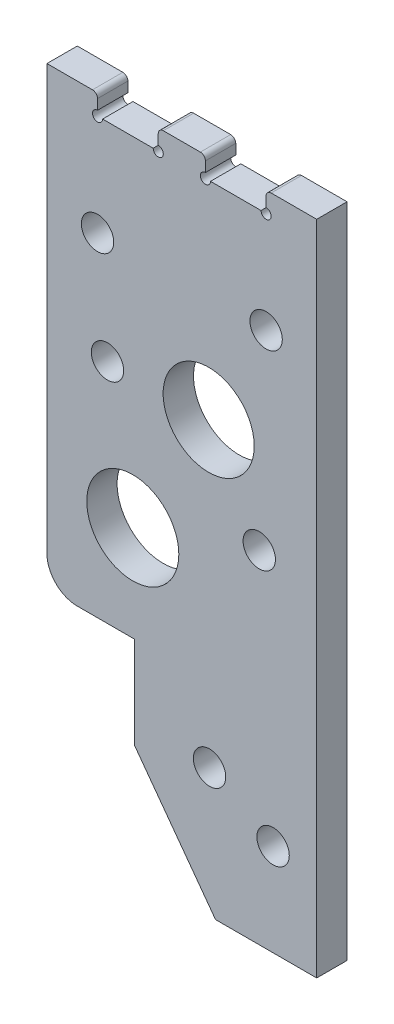
ISO-10303-21;
HEADER;
FILE_DESCRIPTION(('STEP AP214'),'2;1');
FILE_NAME('part.step','',(''),(''),'','','');
FILE_SCHEMA(('AUTOMOTIVE_DESIGN { 1 0 10303 214 1 1 1 1 }'));
ENDSEC;
DATA;
#1=APPLICATION_CONTEXT('core data for automotive mechanical design processes');
#2=APPLICATION_PROTOCOL_DEFINITION('international standard','automotive_design',2000,#1);
#3=PRODUCT_CONTEXT('',#1,'mechanical');
#4=PRODUCT('Part','Part','',(#3));
#5=PRODUCT_RELATED_PRODUCT_CATEGORY('part','',(#4));
#6=PRODUCT_DEFINITION_FORMATION('','',#4);
#7=PRODUCT_DEFINITION_CONTEXT('part definition',#1,'design');
#8=PRODUCT_DEFINITION('design','',#6,#7);
#9=PRODUCT_DEFINITION_SHAPE('','',#8);
#10=(LENGTH_UNIT() NAMED_UNIT(*) SI_UNIT(.MILLI.,.METRE.));
#11=(NAMED_UNIT(*) PLANE_ANGLE_UNIT() SI_UNIT($,.RADIAN.));
#12=(NAMED_UNIT(*) SI_UNIT($,.STERADIAN.) SOLID_ANGLE_UNIT());
#13=UNCERTAINTY_MEASURE_WITH_UNIT(LENGTH_MEASURE(1.E-05),#10,'distance_accuracy_value','');
#14=(GEOMETRIC_REPRESENTATION_CONTEXT(3) GLOBAL_UNCERTAINTY_ASSIGNED_CONTEXT((#13)) GLOBAL_UNIT_ASSIGNED_CONTEXT((#10,
#11,#12)) REPRESENTATION_CONTEXT('',''));
#15=CARTESIAN_POINT('',(0.,0.,0.));
#16=DIRECTION('',(0.,0.,1.));
#17=DIRECTION('',(1.,0.,0.));
#18=AXIS2_PLACEMENT_3D('',#15,#16,#17);
#19=CARTESIAN_POINT('',(0.,58.0360342106986,0.));
#20=DIRECTION('',(0.,-1.,0.));
#21=DIRECTION('',(0.,0.,-1.));
#22=AXIS2_PLACEMENT_3D('',#19,#20,#21);
#23=PLANE('',#22);
#24=DIRECTION('',(1.,0.,0.));
#25=VECTOR('',#24,1.);
#26=CARTESIAN_POINT('',(0.,58.0360342106986,3.));
#27=LINE('',#26,#25);
#28=CARTESIAN_POINT('',(-5.0000000000002,58.0360342106986,3.));
#29=VERTEX_POINT('',#28);
#30=CARTESIAN_POINT('',(-0.500000000000204,58.0360342106986,3.));
#31=VERTEX_POINT('',#30);
#32=EDGE_CURVE('E328',#29,#31,#27,.T.);
#33=ORIENTED_EDGE('',*,*,#32,.T.);
#34=DIRECTION('',(0.,0.,1.));
#35=VECTOR('',#34,1.);
#36=CARTESIAN_POINT('',(-0.500000000000204,58.0360342106986,0.));
#37=LINE('',#36,#35);
#38=CARTESIAN_POINT('',(-0.500000000000204,58.0360342106986,0.));
#39=VERTEX_POINT('',#38);
#40=EDGE_CURVE('E11',#31,#39,#37,.F.);
#41=ORIENTED_EDGE('',*,*,#40,.T.);
#42=DIRECTION('',(1.,0.,0.));
#43=VECTOR('',#42,1.);
#44=CARTESIAN_POINT('',(0.,58.0360342106986,0.));
#45=LINE('',#44,#43);
#46=CARTESIAN_POINT('',(-5.0000000000002,58.0360342106986,0.));
#47=VERTEX_POINT('',#46);
#48=EDGE_CURVE('E322',#47,#39,#45,.T.);
#49=ORIENTED_EDGE('',*,*,#48,.F.);
#50=DIRECTION('',(0.,0.,1.));
#51=VECTOR('',#50,1.);
#52=CARTESIAN_POINT('',(-5.0000000000002,58.0360342106986,0.));
#53=LINE('',#52,#51);
#54=EDGE_CURVE('E333',#47,#29,#53,.T.);
#55=ORIENTED_EDGE('',*,*,#54,.T.);
#56=EDGE_LOOP('',(#33,#41,#49,#55));
#57=FACE_BOUND('',#56,.T.);
#58=ADVANCED_FACE('F44',(#57),#23,.F.);
#59=CARTESIAN_POINT('',(6.4999999999998,58.0360342106986,3.));
#60=VERTEX_POINT('',#59);
#61=CARTESIAN_POINT('',(10.1622818720618,58.0360342106986,3.));
#62=VERTEX_POINT('',#61);
#63=EDGE_CURVE('E331',#60,#62,#27,.T.);
#64=ORIENTED_EDGE('',*,*,#63,.T.);
#65=DIRECTION('',(0.,0.,1.));
#66=VECTOR('',#65,1.);
#67=CARTESIAN_POINT('',(10.1622818720618,58.0360342106986,0.));
#68=LINE('',#67,#66);
#69=CARTESIAN_POINT('',(10.1622818720618,58.0360342106986,0.));
#70=VERTEX_POINT('',#69);
#71=EDGE_CURVE('E515',#62,#70,#68,.F.);
#72=ORIENTED_EDGE('',*,*,#71,.T.);
#73=CARTESIAN_POINT('',(6.4999999999998,58.0360342106986,0.));
#74=VERTEX_POINT('',#73);
#75=EDGE_CURVE('E326',#74,#70,#45,.T.);
#76=ORIENTED_EDGE('',*,*,#75,.F.);
#77=DIRECTION('',(0.,0.,1.));
#78=VECTOR('',#77,1.);
#79=CARTESIAN_POINT('',(6.4999999999998,58.0360342106986,0.));
#80=LINE('',#79,#78);
#81=EDGE_CURVE('E511',#74,#60,#80,.T.);
#82=ORIENTED_EDGE('',*,*,#81,.T.);
#83=EDGE_LOOP('',(#64,#72,#76,#82));
#84=FACE_BOUND('',#83,.T.);
#85=ADVANCED_FACE('F592',(#84),#23,.F.);
#86=CARTESIAN_POINT('',(21.6622818720618,0.,3.));
#87=DIRECTION('',(-1.,0.,0.));
#88=DIRECTION('',(0.,0.,1.));
#89=AXIS2_PLACEMENT_3D('',#86,#87,#88);
#90=PLANE('',#89);
#91=DIRECTION('',(0.,1.,0.));
#92=VECTOR('',#91,1.);
#93=CARTESIAN_POINT('',(21.6622818720618,0.,0.));
#94=LINE('',#93,#92);
#95=CARTESIAN_POINT('',(21.6622818720618,-6.90499539699892,0.));
#96=VERTEX_POINT('',#95);
#97=CARTESIAN_POINT('',(21.6622818720618,58.0360342106986,0.));
#98=VERTEX_POINT('',#97);
#99=EDGE_CURVE('E408',#96,#98,#94,.T.);
#100=ORIENTED_EDGE('',*,*,#99,.T.);
#101=DIRECTION('',(0.,0.,1.));
#102=VECTOR('',#101,1.);
#103=CARTESIAN_POINT('',(21.6622818720618,58.0360342106986,0.));
#104=LINE('',#103,#102);
#105=CARTESIAN_POINT('',(21.6622818720618,58.0360342106986,3.));
#106=VERTEX_POINT('',#105);
#107=EDGE_CURVE('E325',#98,#106,#104,.T.);
#108=ORIENTED_EDGE('',*,*,#107,.T.);
#109=DIRECTION('',(0.,1.,0.));
#110=VECTOR('',#109,1.);
#111=CARTESIAN_POINT('',(21.6622818720618,0.,3.));
#112=LINE('',#111,#110);
#113=CARTESIAN_POINT('',(21.6622818720618,-6.90499539699892,3.));
#114=VERTEX_POINT('',#113);
#115=EDGE_CURVE('E387',#114,#106,#112,.T.);
#116=ORIENTED_EDGE('',*,*,#115,.F.);
#117=DIRECTION('',(0.,0.,-1.));
#118=VECTOR('',#117,1.);
#119=CARTESIAN_POINT('',(21.6622818720618,-6.90499539699892,3.));
#120=LINE('',#119,#118);
#121=EDGE_CURVE('E400',#114,#96,#120,.T.);
#122=ORIENTED_EDGE('',*,*,#121,.T.);
#123=EDGE_LOOP('',(#100,#108,#116,#122));
#124=FACE_BOUND('',#123,.T.);
#125=ADVANCED_FACE('F598',(#124),#90,.F.);
#126=CARTESIAN_POINT('',(3.66228187206179,0.,3.));
#127=DIRECTION('',(1.,0.,0.));
#128=DIRECTION('',(0.,0.,-1.));
#129=AXIS2_PLACEMENT_3D('',#126,#127,#128);
#130=PLANE('',#129);
#131=DIRECTION('',(0.,-1.,0.));
#132=VECTOR('',#131,1.);
#133=CARTESIAN_POINT('',(3.66228187206179,0.,0.));
#134=LINE('',#133,#132);
#135=CARTESIAN_POINT('',(3.66228187206179,13.0950046030011,0.));
#136=VERTEX_POINT('',#135);
#137=CARTESIAN_POINT('',(3.66228187206179,3.99641148390984,0.));
#138=VERTEX_POINT('',#137);
#139=EDGE_CURVE('E412',#136,#138,#134,.T.);
#140=ORIENTED_EDGE('',*,*,#139,.T.);
#141=DIRECTION('',(0.,0.,-1.));
#142=VECTOR('',#141,1.);
#143=CARTESIAN_POINT('',(3.66228187206179,3.99641148390984,3.));
#144=LINE('',#143,#142);
#145=CARTESIAN_POINT('',(3.66228187206179,3.99641148390984,3.));
#146=VERTEX_POINT('',#145);
#147=EDGE_CURVE('E427',#146,#138,#144,.T.);
#148=ORIENTED_EDGE('',*,*,#147,.F.);
#149=DIRECTION('',(0.,-1.,0.));
#150=VECTOR('',#149,1.);
#151=CARTESIAN_POINT('',(3.66228187206179,0.,3.));
#152=LINE('',#151,#150);
#153=CARTESIAN_POINT('',(3.66228187206179,13.0950046030011,3.));
#154=VERTEX_POINT('',#153);
#155=EDGE_CURVE('E391',#154,#146,#152,.T.);
#156=ORIENTED_EDGE('',*,*,#155,.F.);
#157=DIRECTION('',(0.,0.,-1.));
#158=VECTOR('',#157,1.);
#159=CARTESIAN_POINT('',(3.66228187206179,13.0950046030011,3.));
#160=LINE('',#159,#158);
#161=EDGE_CURVE('E431',#154,#136,#160,.T.);
#162=ORIENTED_EDGE('',*,*,#161,.T.);
#163=EDGE_LOOP('',(#140,#148,#156,#162));
#164=FACE_BOUND('',#163,.T.);
#165=ADVANCED_FACE('F664',(#164),#130,.F.);
#166=CARTESIAN_POINT('',(4.28657415969723,3.14570345389393,3.));
#167=DIRECTION('',(0.806206221061157,0.591634624681727,0.));
#168=DIRECTION('',(-0.591634624681728,0.806206221061157,0.));
#169=AXIS2_PLACEMENT_3D('',#166,#167,#168);
#170=PLANE('',#169);
#171=DIRECTION('',(0.591634624681727,-0.806206221061157,0.));
#172=VECTOR('',#171,1.);
#173=CARTESIAN_POINT('',(4.28657415969723,3.14570345389393,0.));
#174=LINE('',#173,#172);
#175=CARTESIAN_POINT('',(11.6622818720618,-6.90499539699892,0.));
#176=VERTEX_POINT('',#175);
#177=EDGE_CURVE('E415',#138,#176,#174,.T.);
#178=ORIENTED_EDGE('',*,*,#177,.T.);
#179=DIRECTION('',(0.,0.,-1.));
#180=VECTOR('',#179,1.);
#181=CARTESIAN_POINT('',(11.6622818720618,-6.90499539699892,3.));
#182=LINE('',#181,#180);
#183=CARTESIAN_POINT('',(11.6622818720618,-6.90499539699892,3.));
#184=VERTEX_POINT('',#183);
#185=EDGE_CURVE('E423',#184,#176,#182,.T.);
#186=ORIENTED_EDGE('',*,*,#185,.F.);
#187=DIRECTION('',(0.591634624681727,-0.806206221061157,0.));
#188=VECTOR('',#187,1.);
#189=CARTESIAN_POINT('',(4.28657415969723,3.14570345389393,3.));
#190=LINE('',#189,#188);
#191=EDGE_CURVE('E394',#146,#184,#190,.T.);
#192=ORIENTED_EDGE('',*,*,#191,.F.);
#193=ORIENTED_EDGE('',*,*,#147,.T.);
#194=EDGE_LOOP('',(#178,#186,#192,#193));
#195=FACE_BOUND('',#194,.T.);
#196=ADVANCED_FACE('F660',(#195),#170,.F.);
#197=CARTESIAN_POINT('',(11.0719234852407,5.8086443959848,3.));
#198=DIRECTION('',(0.,0.,-1.));
#199=DIRECTION('',(-1.,0.,0.));
#200=AXIS2_PLACEMENT_3D('',#197,#198,#199);
#201=CYLINDRICAL_SURFACE('',#200,1.6);
#202=CARTESIAN_POINT('',(11.0719234852407,5.8086443959848,3.));
#203=DIRECTION('',(0.,0.,1.));
#204=DIRECTION('',(1.,0.,0.));
#205=AXIS2_PLACEMENT_3D('',#202,#203,#204);
#206=CIRCLE('',#205,1.6);
#207=CARTESIAN_POINT('',(12.6719234852407,5.8086443959848,3.));
#208=VERTEX_POINT('',#207);
#209=EDGE_CURVE('E382',#208,#208,#206,.T.);
#210=ORIENTED_EDGE('',*,*,#209,.T.);
#211=EDGE_LOOP('',(#210));
#212=FACE_BOUND('',#211,.T.);
#213=CARTESIAN_POINT('',(11.0719234852407,5.8086443959848,0.));
#214=DIRECTION('',(0.,0.,1.));
#215=DIRECTION('',(1.,0.,0.));
#216=AXIS2_PLACEMENT_3D('',#213,#214,#215);
#217=CIRCLE('',#216,1.6);
#218=CARTESIAN_POINT('',(12.6719234852407,5.8086443959848,0.));
#219=VERTEX_POINT('',#218);
#220=EDGE_CURVE('E404',#219,#219,#217,.T.);
#221=ORIENTED_EDGE('',*,*,#220,.F.);
#222=EDGE_LOOP('',(#221));
#223=FACE_BOUND('',#222,.T.);
#224=ADVANCED_FACE('F697',(#212,#223),#201,.F.);
#225=CARTESIAN_POINT('',(17.3507061173,2.224156972777,3.));
#226=DIRECTION('',(0.,0.,-1.));
#227=DIRECTION('',(-1.,0.,0.));
#228=AXIS2_PLACEMENT_3D('',#225,#226,#227);
#229=CYLINDRICAL_SURFACE('',#228,1.6);
#230=CARTESIAN_POINT('',(17.3507061173,2.224156972777,3.));
#231=DIRECTION('',(0.,0.,1.));
#232=DIRECTION('',(1.,0.,0.));
#233=AXIS2_PLACEMENT_3D('',#230,#231,#232);
#234=CIRCLE('',#233,1.6);
#235=CARTESIAN_POINT('',(18.9507061173,2.224156972777,3.));
#236=VERTEX_POINT('',#235);
#237=EDGE_CURVE('E378',#236,#236,#234,.T.);
#238=ORIENTED_EDGE('',*,*,#237,.T.);
#239=EDGE_LOOP('',(#238));
#240=FACE_BOUND('',#239,.T.);
#241=CARTESIAN_POINT('',(17.3507061173,2.224156972777,0.));
#242=DIRECTION('',(0.,0.,1.));
#243=DIRECTION('',(1.,0.,0.));
#244=AXIS2_PLACEMENT_3D('',#241,#242,#243);
#245=CIRCLE('',#244,1.6);
#246=CARTESIAN_POINT('',(18.9507061173,2.224156972777,0.));
#247=VERTEX_POINT('',#246);
#248=EDGE_CURVE('E372',#247,#247,#245,.T.);
#249=ORIENTED_EDGE('',*,*,#248,.F.);
#250=EDGE_LOOP('',(#249));
#251=FACE_BOUND('',#250,.T.);
#252=ADVANCED_FACE('F694',(#240,#251),#229,.F.);
#253=CARTESIAN_POINT('',(0.,-6.90499539699891,3.));
#254=DIRECTION('',(0.,1.,0.));
#255=DIRECTION('',(-1.,0.,0.));
#256=AXIS2_PLACEMENT_3D('',#253,#254,#255);
#257=PLANE('',#256);
#258=DIRECTION('',(1.,0.,0.));
#259=VECTOR('',#258,1.);
#260=CARTESIAN_POINT('',(0.,-6.90499539699891,0.));
#261=LINE('',#260,#259);
#262=EDGE_CURVE('E383',#176,#96,#261,.T.);
#263=ORIENTED_EDGE('',*,*,#262,.T.);
#264=ORIENTED_EDGE('',*,*,#121,.F.);
#265=DIRECTION('',(1.,0.,0.));
#266=VECTOR('',#265,1.);
#267=CARTESIAN_POINT('',(0.,-6.90499539699891,3.));
#268=LINE('',#267,#266);
#269=EDGE_CURVE('E397',#184,#114,#268,.T.);
#270=ORIENTED_EDGE('',*,*,#269,.F.);
#271=ORIENTED_EDGE('',*,*,#185,.T.);
#272=EDGE_LOOP('',(#263,#264,#270,#271));
#273=FACE_BOUND('',#272,.T.);
#274=ADVANCED_FACE('F656',(#273),#257,.F.);
#275=CARTESIAN_POINT('',(0.,0.,3.));
#276=DIRECTION('',(0.,0.,1.));
#277=DIRECTION('',(1.,0.,0.));
#278=AXIS2_PLACEMENT_3D('',#275,#276,#277);
#279=PLANE('',#278);
#280=CARTESIAN_POINT('',(16.6622818720618,46.0360342106986,3.));
#281=DIRECTION('',(0.,0.,1.));
#282=DIRECTION('',(-1.,0.,0.));
#283=AXIS2_PLACEMENT_3D('',#280,#281,#282);
#284=CIRCLE('',#283,1.6);
#285=CARTESIAN_POINT('',(15.0622818720618,46.0360342106986,3.));
#286=VERTEX_POINT('',#285);
#287=EDGE_CURVE('E571',#286,#286,#284,.T.);
#288=ORIENTED_EDGE('',*,*,#287,.F.);
#289=EDGE_LOOP('',(#288));
#290=FACE_BOUND('',#289,.T.);
#291=CARTESIAN_POINT('',(17.1622818720618,58.0360342106986,3.));
#292=VERTEX_POINT('',#291);
#293=EDGE_CURVE('E332',#292,#106,#27,.T.);
#294=ORIENTED_EDGE('',*,*,#293,.F.);
#295=CARTESIAN_POINT('',(17.1622818720618,57.5360342106986,3.));
#296=DIRECTION('',(0.,0.,1.));
#297=DIRECTION('',(1.,0.,0.));
#298=AXIS2_PLACEMENT_3D('',#295,#296,#297);
#299=CIRCLE('',#298,0.5);
#300=CARTESIAN_POINT('',(16.6622818720618,57.5360342106986,3.));
#301=VERTEX_POINT('',#300);
#302=EDGE_CURVE('E490',#292,#301,#299,.T.);
#303=ORIENTED_EDGE('',*,*,#302,.T.);
#304=DIRECTION('',(0.,1.,0.));
#305=VECTOR('',#304,1.);
#306=CARTESIAN_POINT('',(16.6622818720618,58.0360342106986,3.));
#307=LINE('',#306,#305);
#308=CARTESIAN_POINT('',(16.6622818720618,56.5360342106986,3.));
#309=VERTEX_POINT('',#308);
#310=EDGE_CURVE('E303',#309,#301,#307,.T.);
#311=ORIENTED_EDGE('',*,*,#310,.F.);
#312=CARTESIAN_POINT('',(16.6622818720618,56.0360342106986,3.));
#313=DIRECTION('',(0.,0.,1.));
#314=DIRECTION('',(1.,0.,0.));
#315=AXIS2_PLACEMENT_3D('',#312,#313,#314);
#316=CIRCLE('',#315,0.499999999999999);
#317=CARTESIAN_POINT('',(16.1622818720618,56.0360342106986,3.));
#318=VERTEX_POINT('',#317);
#319=EDGE_CURVE('E565',#318,#309,#316,.T.);
#320=ORIENTED_EDGE('',*,*,#319,.F.);
#321=DIRECTION('',(1.,0.,0.));
#322=VECTOR('',#321,1.);
#323=CARTESIAN_POINT('',(10.6622818720618,56.0360342106986,3.));
#324=LINE('',#323,#322);
#325=CARTESIAN_POINT('',(11.1622818720618,56.0360342106986,3.));
#326=VERTEX_POINT('',#325);
#327=EDGE_CURVE('E314',#326,#318,#324,.T.);
#328=ORIENTED_EDGE('',*,*,#327,.F.);
#329=CARTESIAN_POINT('',(10.6622818720618,56.0360342106986,3.));
#330=DIRECTION('',(0.,0.,1.));
#331=DIRECTION('',(1.,0.,0.));
#332=AXIS2_PLACEMENT_3D('',#329,#330,#331);
#333=CIRCLE('',#332,0.500000000000001);
#334=CARTESIAN_POINT('',(10.6622818720618,56.5360342106986,3.));
#335=VERTEX_POINT('',#334);
#336=EDGE_CURVE('E268',#335,#326,#333,.T.);
#337=ORIENTED_EDGE('',*,*,#336,.F.);
#338=DIRECTION('',(0.,-1.,0.));
#339=VECTOR('',#338,1.);
#340=CARTESIAN_POINT('',(10.6622818720618,58.0360342106986,3.));
#341=LINE('',#340,#339);
#342=CARTESIAN_POINT('',(10.6622818720618,57.5360342106986,3.));
#343=VERTEX_POINT('',#342);
#344=EDGE_CURVE('E311',#343,#335,#341,.T.);
#345=ORIENTED_EDGE('',*,*,#344,.F.);
#346=CARTESIAN_POINT('',(10.1622818720618,57.5360342106986,3.));
#347=DIRECTION('',(0.,0.,1.));
#348=DIRECTION('',(1.,0.,0.));
#349=AXIS2_PLACEMENT_3D('',#346,#347,#348);
#350=CIRCLE('',#349,0.5);
#351=EDGE_CURVE('E487',#343,#62,#350,.T.);
#352=ORIENTED_EDGE('',*,*,#351,.T.);
#353=ORIENTED_EDGE('',*,*,#63,.F.);
#354=CARTESIAN_POINT('',(6.4999999999998,57.5360342106986,3.));
#355=DIRECTION('',(0.,0.,1.));
#356=DIRECTION('',(1.,0.,0.));
#357=AXIS2_PLACEMENT_3D('',#354,#355,#356);
#358=CIRCLE('',#357,0.5);
#359=CARTESIAN_POINT('',(5.9999999999998,57.5360342106986,3.));
#360=VERTEX_POINT('',#359);
#361=EDGE_CURVE('E286',#60,#360,#358,.T.);
#362=ORIENTED_EDGE('',*,*,#361,.T.);
#363=DIRECTION('',(0.,1.,0.));
#364=VECTOR('',#363,1.);
#365=CARTESIAN_POINT('',(5.9999999999998,58.0360342106986,3.));
#366=LINE('',#365,#364);
#367=CARTESIAN_POINT('',(5.9999999999998,56.5360342106986,3.));
#368=VERTEX_POINT('',#367);
#369=EDGE_CURVE('E274',#368,#360,#366,.T.);
#370=ORIENTED_EDGE('',*,*,#369,.F.);
#371=CARTESIAN_POINT('',(5.9999999999998,56.0360342106986,3.));
#372=DIRECTION('',(0.,0.,1.));
#373=DIRECTION('',(1.,0.,0.));
#374=AXIS2_PLACEMENT_3D('',#371,#372,#373);
#375=CIRCLE('',#374,0.500000000000002);
#376=CARTESIAN_POINT('',(5.49999999999979,56.0360342106986,3.));
#377=VERTEX_POINT('',#376);
#378=EDGE_CURVE('E255',#377,#368,#375,.T.);
#379=ORIENTED_EDGE('',*,*,#378,.F.);
#380=DIRECTION('',(1.,0.,0.));
#381=VECTOR('',#380,1.);
#382=CARTESIAN_POINT('',(-2.03585079067445E-13,56.0360342106986,3.));
#383=LINE('',#382,#381);
#384=CARTESIAN_POINT('',(0.499999999999797,56.0360342106986,3.));
#385=VERTEX_POINT('',#384);
#386=EDGE_CURVE('E289',#385,#377,#383,.T.);
#387=ORIENTED_EDGE('',*,*,#386,.F.);
#388=CARTESIAN_POINT('',(-2.03585079067445E-13,56.0360342106986,3.));
#389=DIRECTION('',(0.,0.,1.));
#390=DIRECTION('',(1.,0.,0.));
#391=AXIS2_PLACEMENT_3D('',#388,#389,#390);
#392=CIRCLE('',#391,0.5);
#393=CARTESIAN_POINT('',(-2.03646311407403E-13,56.5360342106986,3.));
#394=VERTEX_POINT('',#393);
#395=EDGE_CURVE('E267',#394,#385,#392,.T.);
#396=ORIENTED_EDGE('',*,*,#395,.F.);
#397=DIRECTION('',(0.,-1.,0.));
#398=VECTOR('',#397,1.);
#399=CARTESIAN_POINT('',(-2.03830008427275E-13,58.0360342106986,3.));
#400=LINE('',#399,#398);
#401=CARTESIAN_POINT('',(-2.03768776087317E-13,57.5360342106986,3.));
#402=VERTEX_POINT('',#401);
#403=EDGE_CURVE('E295',#402,#394,#400,.T.);
#404=ORIENTED_EDGE('',*,*,#403,.F.);
#405=CARTESIAN_POINT('',(-0.500000000000204,57.5360342106986,3.));
#406=DIRECTION('',(0.,0.,1.));
#407=DIRECTION('',(1.,0.,0.));
#408=AXIS2_PLACEMENT_3D('',#405,#406,#407);
#409=CIRCLE('',#408,0.5);
#410=EDGE_CURVE('E482',#402,#31,#409,.T.);
#411=ORIENTED_EDGE('',*,*,#410,.T.);
#412=ORIENTED_EDGE('',*,*,#32,.F.);
#413=DIRECTION('',(0.,-1.,0.));
#414=VECTOR('',#413,1.);
#415=CARTESIAN_POINT('',(-5.00000000000018,55.0950046030011,3.));
#416=LINE('',#415,#414);
#417=CARTESIAN_POINT('',(-5.00000000000018,16.0950046030011,3.));
#418=VERTEX_POINT('',#417);
#419=EDGE_CURVE('E369',#29,#418,#416,.T.);
#420=ORIENTED_EDGE('',*,*,#419,.T.);
#421=CARTESIAN_POINT('',(-2.00000000000018,16.0950046030011,3.));
#422=DIRECTION('',(0.,0.,1.));
#423=DIRECTION('',(1.,0.,0.));
#424=AXIS2_PLACEMENT_3D('',#421,#422,#423);
#425=CIRCLE('',#424,3.);
#426=CARTESIAN_POINT('',(-2.00000000000018,13.0950046030011,3.));
#427=VERTEX_POINT('',#426);
#428=EDGE_CURVE('E439',#418,#427,#425,.T.);
#429=ORIENTED_EDGE('',*,*,#428,.T.);
#430=DIRECTION('',(1.,0.,0.));
#431=VECTOR('',#430,1.);
#432=CARTESIAN_POINT('',(-5.00000000000018,13.0950046030011,3.));
#433=LINE('',#432,#431);
#434=EDGE_CURVE('E373',#427,#154,#433,.T.);
#435=ORIENTED_EDGE('',*,*,#434,.T.);
#436=ORIENTED_EDGE('',*,*,#155,.T.);
#437=ORIENTED_EDGE('',*,*,#191,.T.);
#438=ORIENTED_EDGE('',*,*,#269,.T.);
#439=ORIENTED_EDGE('',*,*,#115,.T.);
#440=EDGE_LOOP('',(#294,#303,#311,#320,#328,#337,#345,#352,#353,#362,#370,#379,#387,#396,#404,
#411,#412,#420,#429,#435,#436,#437,#438,#439));
#441=FACE_BOUND('',#440,.T.);
#442=CARTESIAN_POINT('',(-2.03830008427275E-13,46.0360342106986,3.));
#443=DIRECTION('',(0.,0.,1.));
#444=DIRECTION('',(1.,0.,0.));
#445=AXIS2_PLACEMENT_3D('',#442,#443,#444);
#446=CIRCLE('',#445,1.6);
#447=CARTESIAN_POINT('',(1.5999999999998,46.0360342106986,3.));
#448=VERTEX_POINT('',#447);
#449=EDGE_CURVE('E337',#448,#448,#446,.F.);
#450=ORIENTED_EDGE('',*,*,#449,.T.);
#451=EDGE_LOOP('',(#450));
#452=FACE_BOUND('',#451,.T.);
#453=CARTESIAN_POINT('',(0.984643758680834,35.5323305802641,3.));
#454=DIRECTION('',(0.,0.,1.));
#455=DIRECTION('',(1.,0.,0.));
#456=AXIS2_PLACEMENT_3D('',#453,#454,#455);
#457=CIRCLE('',#456,1.6);
#458=CARTESIAN_POINT('',(2.58464375868083,35.5323305802641,3.));
#459=VERTEX_POINT('',#458);
#460=EDGE_CURVE('E345',#459,#459,#457,.T.);
#461=ORIENTED_EDGE('',*,*,#460,.F.);
#462=EDGE_LOOP('',(#461));
#463=FACE_BOUND('',#462,.T.);
#464=CARTESIAN_POINT('',(15.9846437586806,26.8720765424193,3.));
#465=DIRECTION('',(0.,0.,1.));
#466=DIRECTION('',(1.,0.,0.));
#467=AXIS2_PLACEMENT_3D('',#464,#465,#466);
#468=CIRCLE('',#467,1.6);
#469=CARTESIAN_POINT('',(17.5846437586806,26.8720765424193,3.));
#470=VERTEX_POINT('',#469);
#471=EDGE_CURVE('E350',#470,#470,#468,.T.);
#472=ORIENTED_EDGE('',*,*,#471,.F.);
#473=EDGE_LOOP('',(#472));
#474=FACE_BOUND('',#473,.T.);
#475=CARTESIAN_POINT('',(10.9846437586808,35.5323305802638,3.));
#476=DIRECTION('',(0.,0.,1.));
#477=DIRECTION('',(1.,0.,0.));
#478=AXIS2_PLACEMENT_3D('',#475,#476,#477);
#479=CIRCLE('',#478,4.5);
#480=CARTESIAN_POINT('',(15.4846437586808,35.5323305802638,3.));
#481=VERTEX_POINT('',#480);
#482=EDGE_CURVE('E354',#481,#481,#479,.T.);
#483=ORIENTED_EDGE('',*,*,#482,.F.);
#484=EDGE_LOOP('',(#483));
#485=FACE_BOUND('',#484,.T.);
#486=CARTESIAN_POINT('',(3.48464375868086,22.5419495234972,3.));
#487=DIRECTION('',(0.,0.,1.));
#488=DIRECTION('',(1.,0.,0.));
#489=AXIS2_PLACEMENT_3D('',#486,#487,#488);
#490=CIRCLE('',#489,4.55);
#491=CARTESIAN_POINT('',(8.03464375868087,22.5419495234972,3.));
#492=VERTEX_POINT('',#491);
#493=EDGE_CURVE('E360',#492,#492,#490,.T.);
#494=ORIENTED_EDGE('',*,*,#493,.F.);
#495=EDGE_LOOP('',(#494));
#496=FACE_BOUND('',#495,.T.);
#497=ORIENTED_EDGE('',*,*,#237,.F.);
#498=EDGE_LOOP('',(#497));
#499=FACE_BOUND('',#498,.T.);
#500=ORIENTED_EDGE('',*,*,#209,.F.);
#501=EDGE_LOOP('',(#500));
#502=FACE_BOUND('',#501,.T.);
#503=ADVANCED_FACE('F283',(#290,#441,#452,#463,#474,#485,#496,#499,#502),#279,.T.);
#504=CARTESIAN_POINT('',(0.,0.,0.));
#505=DIRECTION('',(0.,0.,1.));
#506=DIRECTION('',(1.,0.,0.));
#507=AXIS2_PLACEMENT_3D('',#504,#505,#506);
#508=PLANE('',#507);
#509=CARTESIAN_POINT('',(16.6622818720618,46.0360342106986,0.));
#510=DIRECTION('',(0.,0.,1.));
#511=DIRECTION('',(1.,0.,0.));
#512=AXIS2_PLACEMENT_3D('',#509,#510,#511);
#513=CIRCLE('',#512,1.6);
#514=CARTESIAN_POINT('',(18.2622818720618,46.0360342106986,0.));
#515=VERTEX_POINT('',#514);
#516=EDGE_CURVE('E48',#515,#515,#513,.T.);
#517=ORIENTED_EDGE('',*,*,#516,.T.);
#518=EDGE_LOOP('',(#517));
#519=FACE_BOUND('',#518,.T.);
#520=DIRECTION('',(0.,1.,0.));
#521=VECTOR('',#520,1.);
#522=CARTESIAN_POINT('',(16.6622818720618,58.0360342106986,0.));
#523=LINE('',#522,#521);
#524=CARTESIAN_POINT('',(16.6622818720618,56.5360342106986,0.));
#525=VERTEX_POINT('',#524);
#526=CARTESIAN_POINT('',(16.6622818720618,57.5360342106986,0.));
#527=VERTEX_POINT('',#526);
#528=EDGE_CURVE('E307',#525,#527,#523,.T.);
#529=ORIENTED_EDGE('',*,*,#528,.T.);
#530=CARTESIAN_POINT('',(17.1622818720618,57.5360342106986,0.));
#531=DIRECTION('',(0.,0.,1.));
#532=DIRECTION('',(1.,0.,0.));
#533=AXIS2_PLACEMENT_3D('',#530,#531,#532);
#534=CIRCLE('',#533,0.5);
#535=CARTESIAN_POINT('',(17.1622818720618,58.0360342106986,0.));
#536=VERTEX_POINT('',#535);
#537=EDGE_CURVE('E504',#527,#536,#534,.F.);
#538=ORIENTED_EDGE('',*,*,#537,.T.);
#539=EDGE_CURVE('E327',#536,#98,#45,.T.);
#540=ORIENTED_EDGE('',*,*,#539,.T.);
#541=ORIENTED_EDGE('',*,*,#99,.F.);
#542=ORIENTED_EDGE('',*,*,#262,.F.);
#543=ORIENTED_EDGE('',*,*,#177,.F.);
#544=ORIENTED_EDGE('',*,*,#139,.F.);
#545=DIRECTION('',(1.,0.,0.));
#546=VECTOR('',#545,1.);
#547=CARTESIAN_POINT('',(-5.00000000000018,13.0950046030011,0.));
#548=LINE('',#547,#546);
#549=CARTESIAN_POINT('',(-2.00000000000018,13.0950046030011,0.));
#550=VERTEX_POINT('',#549);
#551=EDGE_CURVE('E365',#550,#136,#548,.T.);
#552=ORIENTED_EDGE('',*,*,#551,.F.);
#553=CARTESIAN_POINT('',(-2.00000000000018,16.0950046030011,0.));
#554=DIRECTION('',(0.,0.,1.));
#555=DIRECTION('',(1.,0.,0.));
#556=AXIS2_PLACEMENT_3D('',#553,#554,#555);
#557=CIRCLE('',#556,3.);
#558=CARTESIAN_POINT('',(-5.00000000000018,16.0950046030011,0.));
#559=VERTEX_POINT('',#558);
#560=EDGE_CURVE('E445',#550,#559,#557,.F.);
#561=ORIENTED_EDGE('',*,*,#560,.T.);
#562=DIRECTION('',(0.,-1.,0.));
#563=VECTOR('',#562,1.);
#564=CARTESIAN_POINT('',(-5.00000000000018,55.0950046030011,0.));
#565=LINE('',#564,#563);
#566=EDGE_CURVE('E368',#47,#559,#565,.T.);
#567=ORIENTED_EDGE('',*,*,#566,.F.);
#568=ORIENTED_EDGE('',*,*,#48,.T.);
#569=CARTESIAN_POINT('',(-0.500000000000204,57.5360342106986,0.));
#570=DIRECTION('',(0.,0.,1.));
#571=DIRECTION('',(1.,0.,0.));
#572=AXIS2_PLACEMENT_3D('',#569,#570,#571);
#573=CIRCLE('',#572,0.5);
#574=CARTESIAN_POINT('',(-2.03768776087317E-13,57.5360342106986,0.));
#575=VERTEX_POINT('',#574);
#576=EDGE_CURVE('E496',#39,#575,#573,.F.);
#577=ORIENTED_EDGE('',*,*,#576,.T.);
#578=DIRECTION('',(0.,-1.,0.));
#579=VECTOR('',#578,1.);
#580=CARTESIAN_POINT('',(-2.03830008427275E-13,58.0360342106986,0.));
#581=LINE('',#580,#579);
#582=CARTESIAN_POINT('',(-2.03646311407403E-13,56.5360342106986,0.));
#583=VERTEX_POINT('',#582);
#584=EDGE_CURVE('E288',#575,#583,#581,.T.);
#585=ORIENTED_EDGE('',*,*,#584,.T.);
#586=CARTESIAN_POINT('',(-2.03585079067445E-13,56.0360342106986,0.));
#587=DIRECTION('',(0.,0.,1.));
#588=DIRECTION('',(1.,0.,0.));
#589=AXIS2_PLACEMENT_3D('',#586,#587,#588);
#590=CIRCLE('',#589,0.5);
#591=CARTESIAN_POINT('',(0.499999999999797,56.0360342106986,0.));
#592=VERTEX_POINT('',#591);
#593=EDGE_CURVE('E279',#583,#592,#590,.T.);
#594=ORIENTED_EDGE('',*,*,#593,.T.);
#595=DIRECTION('',(1.,0.,0.));
#596=VECTOR('',#595,1.);
#597=CARTESIAN_POINT('',(-2.03585079067445E-13,56.0360342106986,0.));
#598=LINE('',#597,#596);
#599=CARTESIAN_POINT('',(5.49999999999979,56.0360342106986,0.));
#600=VERTEX_POINT('',#599);
#601=EDGE_CURVE('E293',#592,#600,#598,.T.);
#602=ORIENTED_EDGE('',*,*,#601,.T.);
#603=CARTESIAN_POINT('',(5.9999999999998,56.0360342106986,0.));
#604=DIRECTION('',(0.,0.,1.));
#605=DIRECTION('',(1.,0.,0.));
#606=AXIS2_PLACEMENT_3D('',#603,#604,#605);
#607=CIRCLE('',#606,0.500000000000002);
#608=CARTESIAN_POINT('',(5.9999999999998,56.5360342106986,0.));
#609=VERTEX_POINT('',#608);
#610=EDGE_CURVE('E280',#600,#609,#607,.T.);
#611=ORIENTED_EDGE('',*,*,#610,.T.);
#612=DIRECTION('',(0.,1.,0.));
#613=VECTOR('',#612,1.);
#614=CARTESIAN_POINT('',(5.9999999999998,58.0360342106986,0.));
#615=LINE('',#614,#613);
#616=CARTESIAN_POINT('',(5.9999999999998,57.5360342106986,0.));
#617=VERTEX_POINT('',#616);
#618=EDGE_CURVE('E277',#609,#617,#615,.T.);
#619=ORIENTED_EDGE('',*,*,#618,.T.);
#620=CARTESIAN_POINT('',(6.4999999999998,57.5360342106986,0.));
#621=DIRECTION('',(0.,0.,1.));
#622=DIRECTION('',(1.,0.,0.));
#623=AXIS2_PLACEMENT_3D('',#620,#621,#622);
#624=CIRCLE('',#623,0.5);
#625=EDGE_CURVE('E499',#617,#74,#624,.F.);
#626=ORIENTED_EDGE('',*,*,#625,.T.);
#627=ORIENTED_EDGE('',*,*,#75,.T.);
#628=CARTESIAN_POINT('',(10.1622818720618,57.5360342106986,0.));
#629=DIRECTION('',(0.,0.,1.));
#630=DIRECTION('',(1.,0.,0.));
#631=AXIS2_PLACEMENT_3D('',#628,#629,#630);
#632=CIRCLE('',#631,0.5);
#633=CARTESIAN_POINT('',(10.6622818720618,57.5360342106986,0.));
#634=VERTEX_POINT('',#633);
#635=EDGE_CURVE('E71',#70,#634,#632,.F.);
#636=ORIENTED_EDGE('',*,*,#635,.T.);
#637=DIRECTION('',(0.,-1.,0.));
#638=VECTOR('',#637,1.);
#639=CARTESIAN_POINT('',(10.6622818720618,58.0360342106986,0.));
#640=LINE('',#639,#638);
#641=CARTESIAN_POINT('',(10.6622818720618,56.5360342106986,0.));
#642=VERTEX_POINT('',#641);
#643=EDGE_CURVE('E299',#634,#642,#640,.T.);
#644=ORIENTED_EDGE('',*,*,#643,.T.);
#645=CARTESIAN_POINT('',(10.6622818720618,56.0360342106986,0.));
#646=DIRECTION('',(0.,0.,1.));
#647=DIRECTION('',(1.,0.,0.));
#648=AXIS2_PLACEMENT_3D('',#645,#646,#647);
#649=CIRCLE('',#648,0.500000000000001);
#650=CARTESIAN_POINT('',(11.1622818720618,56.0360342106986,0.));
#651=VERTEX_POINT('',#650);
#652=EDGE_CURVE('E546',#642,#651,#649,.T.);
#653=ORIENTED_EDGE('',*,*,#652,.T.);
#654=DIRECTION('',(1.,0.,0.));
#655=VECTOR('',#654,1.);
#656=CARTESIAN_POINT('',(10.6622818720618,56.0360342106986,0.));
#657=LINE('',#656,#655);
#658=CARTESIAN_POINT('',(16.1622818720618,56.0360342106986,0.));
#659=VERTEX_POINT('',#658);
#660=EDGE_CURVE('E302',#651,#659,#657,.T.);
#661=ORIENTED_EDGE('',*,*,#660,.T.);
#662=CARTESIAN_POINT('',(16.6622818720618,56.0360342106986,0.));
#663=DIRECTION('',(0.,0.,1.));
#664=DIRECTION('',(1.,0.,0.));
#665=AXIS2_PLACEMENT_3D('',#662,#663,#664);
#666=CIRCLE('',#665,0.499999999999999);
#667=EDGE_CURVE('E554',#659,#525,#666,.T.);
#668=ORIENTED_EDGE('',*,*,#667,.T.);
#669=EDGE_LOOP('',(#529,#538,#540,#541,#542,#543,#544,#552,#561,#567,#568,#577,#585,#594,#602,
#611,#619,#626,#627,#636,#644,#653,#661,#668));
#670=FACE_BOUND('',#669,.T.);
#671=CARTESIAN_POINT('',(-2.03830008427275E-13,46.0360342106986,0.));
#672=DIRECTION('',(0.,0.,1.));
#673=DIRECTION('',(1.,0.,0.));
#674=AXIS2_PLACEMENT_3D('',#671,#672,#673);
#675=CIRCLE('',#674,1.6);
#676=CARTESIAN_POINT('',(1.5999999999998,46.0360342106986,0.));
#677=VERTEX_POINT('',#676);
#678=EDGE_CURVE('E344',#677,#677,#675,.F.);
#679=ORIENTED_EDGE('',*,*,#678,.F.);
#680=EDGE_LOOP('',(#679));
#681=FACE_BOUND('',#680,.T.);
#682=CARTESIAN_POINT('',(0.984643758680834,35.5323305802641,0.));
#683=DIRECTION('',(0.,0.,1.));
#684=DIRECTION('',(1.,0.,0.));
#685=AXIS2_PLACEMENT_3D('',#682,#683,#684);
#686=CIRCLE('',#685,1.6);
#687=CARTESIAN_POINT('',(2.58464375868083,35.5323305802641,0.));
#688=VERTEX_POINT('',#687);
#689=EDGE_CURVE('E359',#688,#688,#686,.T.);
#690=ORIENTED_EDGE('',*,*,#689,.T.);
#691=EDGE_LOOP('',(#690));
#692=FACE_BOUND('',#691,.T.);
#693=CARTESIAN_POINT('',(15.9846437586806,26.8720765424193,0.));
#694=DIRECTION('',(0.,0.,1.));
#695=DIRECTION('',(1.,0.,0.));
#696=AXIS2_PLACEMENT_3D('',#693,#694,#695);
#697=CIRCLE('',#696,1.6);
#698=CARTESIAN_POINT('',(17.5846437586806,26.8720765424193,0.));
#699=VERTEX_POINT('',#698);
#700=EDGE_CURVE('E349',#699,#699,#697,.T.);
#701=ORIENTED_EDGE('',*,*,#700,.T.);
#702=EDGE_LOOP('',(#701));
#703=FACE_BOUND('',#702,.T.);
#704=CARTESIAN_POINT('',(10.9846437586808,35.5323305802638,0.));
#705=DIRECTION('',(0.,0.,1.));
#706=DIRECTION('',(1.,0.,0.));
#707=AXIS2_PLACEMENT_3D('',#704,#705,#706);
#708=CIRCLE('',#707,4.5);
#709=CARTESIAN_POINT('',(15.4846437586808,35.5323305802638,0.));
#710=VERTEX_POINT('',#709);
#711=EDGE_CURVE('E358',#710,#710,#708,.T.);
#712=ORIENTED_EDGE('',*,*,#711,.T.);
#713=EDGE_LOOP('',(#712));
#714=FACE_BOUND('',#713,.T.);
#715=CARTESIAN_POINT('',(3.48464375868086,22.5419495234972,0.));
#716=DIRECTION('',(0.,0.,1.));
#717=DIRECTION('',(1.,0.,0.));
#718=AXIS2_PLACEMENT_3D('',#715,#716,#717);
#719=CIRCLE('',#718,4.55);
#720=CARTESIAN_POINT('',(8.03464375868087,22.5419495234972,0.));
#721=VERTEX_POINT('',#720);
#722=EDGE_CURVE('E364',#721,#721,#719,.T.);
#723=ORIENTED_EDGE('',*,*,#722,.T.);
#724=EDGE_LOOP('',(#723));
#725=FACE_BOUND('',#724,.T.);
#726=ORIENTED_EDGE('',*,*,#248,.T.);
#727=EDGE_LOOP('',(#726));
#728=FACE_BOUND('',#727,.T.);
#729=ORIENTED_EDGE('',*,*,#220,.T.);
#730=EDGE_LOOP('',(#729));
#731=FACE_BOUND('',#730,.T.);
#732=ADVANCED_FACE('F581',(#519,#670,#681,#692,#703,#714,#725,#728,#731),#508,.F.);
#733=CARTESIAN_POINT('',(-5.00000000000018,13.0950046030011,0.));
#734=DIRECTION('',(0.,-1.,0.));
#735=DIRECTION('',(0.,0.,-1.));
#736=AXIS2_PLACEMENT_3D('',#733,#734,#735);
#737=PLANE('',#736);
#738=ORIENTED_EDGE('',*,*,#434,.F.);
#739=DIRECTION('',(0.,0.,1.));
#740=VECTOR('',#739,1.);
#741=CARTESIAN_POINT('',(-2.00000000000018,13.0950046030011,0.));
#742=LINE('',#741,#740);
#743=EDGE_CURVE('E442',#427,#550,#742,.F.);
#744=ORIENTED_EDGE('',*,*,#743,.T.);
#745=ORIENTED_EDGE('',*,*,#551,.T.);
#746=ORIENTED_EDGE('',*,*,#161,.F.);
#747=EDGE_LOOP('',(#738,#744,#745,#746));
#748=FACE_BOUND('',#747,.T.);
#749=ADVANCED_FACE('F678',(#748),#737,.T.);
#750=CARTESIAN_POINT('',(-5.00000000000018,55.0950046030011,0.));
#751=DIRECTION('',(-1.,0.,0.));
#752=DIRECTION('',(0.,-1.,0.));
#753=AXIS2_PLACEMENT_3D('',#750,#751,#752);
#754=PLANE('',#753);
#755=ORIENTED_EDGE('',*,*,#419,.F.);
#756=ORIENTED_EDGE('',*,*,#54,.F.);
#757=ORIENTED_EDGE('',*,*,#566,.T.);
#758=DIRECTION('',(0.,0.,1.));
#759=VECTOR('',#758,1.);
#760=CARTESIAN_POINT('',(-5.00000000000018,16.0950046030011,0.));
#761=LINE('',#760,#759);
#762=EDGE_CURVE('E435',#559,#418,#761,.T.);
#763=ORIENTED_EDGE('',*,*,#762,.T.);
#764=EDGE_LOOP('',(#755,#756,#757,#763));
#765=FACE_BOUND('',#764,.T.);
#766=ADVANCED_FACE('F675',(#765),#754,.T.);
#767=CARTESIAN_POINT('',(-2.00000000000018,16.0950046030011,0.));
#768=DIRECTION('',(0.,0.,1.));
#769=DIRECTION('',(1.,0.,0.));
#770=AXIS2_PLACEMENT_3D('',#767,#768,#769);
#771=CYLINDRICAL_SURFACE('',#770,3.);
#772=ORIENTED_EDGE('',*,*,#560,.F.);
#773=ORIENTED_EDGE('',*,*,#743,.F.);
#774=ORIENTED_EDGE('',*,*,#428,.F.);
#775=ORIENTED_EDGE('',*,*,#762,.F.);
#776=EDGE_LOOP('',(#772,#773,#774,#775));
#777=FACE_BOUND('',#776,.T.);
#778=ADVANCED_FACE('F672',(#777),#771,.T.);
#779=CARTESIAN_POINT('',(3.48464375868086,22.5419495234972,-7.));
#780=DIRECTION('',(0.,0.,1.));
#781=DIRECTION('',(1.,0.,0.));
#782=AXIS2_PLACEMENT_3D('',#779,#780,#781);
#783=CYLINDRICAL_SURFACE('',#782,4.55);
#784=ORIENTED_EDGE('',*,*,#493,.T.);
#785=EDGE_LOOP('',(#784));
#786=FACE_BOUND('',#785,.T.);
#787=ORIENTED_EDGE('',*,*,#722,.F.);
#788=EDGE_LOOP('',(#787));
#789=FACE_BOUND('',#788,.T.);
#790=ADVANCED_FACE('F710',(#786,#789),#783,.F.);
#791=CARTESIAN_POINT('',(10.9846437586808,35.5323305802638,-23.41));
#792=DIRECTION('',(0.,0.,1.));
#793=DIRECTION('',(1.,0.,0.));
#794=AXIS2_PLACEMENT_3D('',#791,#792,#793);
#795=CYLINDRICAL_SURFACE('',#794,4.5);
#796=ORIENTED_EDGE('',*,*,#482,.T.);
#797=EDGE_LOOP('',(#796));
#798=FACE_BOUND('',#797,.T.);
#799=ORIENTED_EDGE('',*,*,#711,.F.);
#800=EDGE_LOOP('',(#799));
#801=FACE_BOUND('',#800,.T.);
#802=ADVANCED_FACE('F862',(#798,#801),#795,.F.);
#803=CARTESIAN_POINT('',(15.9846437586806,26.8720765424193,-7.));
#804=DIRECTION('',(0.,0.,1.));
#805=DIRECTION('',(1.,0.,0.));
#806=AXIS2_PLACEMENT_3D('',#803,#804,#805);
#807=CYLINDRICAL_SURFACE('',#806,1.6);
#808=ORIENTED_EDGE('',*,*,#471,.T.);
#809=EDGE_LOOP('',(#808));
#810=FACE_BOUND('',#809,.T.);
#811=ORIENTED_EDGE('',*,*,#700,.F.);
#812=EDGE_LOOP('',(#811));
#813=FACE_BOUND('',#812,.T.);
#814=ADVANCED_FACE('F852',(#810,#813),#807,.F.);
#815=CARTESIAN_POINT('',(0.984643758680834,35.5323305802641,-7.));
#816=DIRECTION('',(0.,0.,1.));
#817=DIRECTION('',(1.,0.,0.));
#818=AXIS2_PLACEMENT_3D('',#815,#816,#817);
#819=CYLINDRICAL_SURFACE('',#818,1.6);
#820=ORIENTED_EDGE('',*,*,#460,.T.);
#821=EDGE_LOOP('',(#820));
#822=FACE_BOUND('',#821,.T.);
#823=ORIENTED_EDGE('',*,*,#689,.F.);
#824=EDGE_LOOP('',(#823));
#825=FACE_BOUND('',#824,.T.);
#826=ADVANCED_FACE('F612',(#822,#825),#819,.F.);
#827=CARTESIAN_POINT('',(-2.03830008427275E-13,46.0360342106986,-7.));
#828=DIRECTION('',(0.,0.,1.));
#829=DIRECTION('',(1.,0.,0.));
#830=AXIS2_PLACEMENT_3D('',#827,#828,#829);
#831=CYLINDRICAL_SURFACE('',#830,1.6);
#832=ORIENTED_EDGE('',*,*,#449,.F.);
#833=EDGE_LOOP('',(#832));
#834=FACE_BOUND('',#833,.T.);
#835=ORIENTED_EDGE('',*,*,#678,.T.);
#836=EDGE_LOOP('',(#835));
#837=FACE_BOUND('',#836,.T.);
#838=ADVANCED_FACE('F604',(#834,#837),#831,.F.);
#839=ORIENTED_EDGE('',*,*,#539,.F.);
#840=DIRECTION('',(0.,0.,1.));
#841=VECTOR('',#840,1.);
#842=CARTESIAN_POINT('',(17.1622818720618,58.0360342106986,0.));
#843=LINE('',#842,#841);
#844=EDGE_CURVE('E478',#536,#292,#843,.T.);
#845=ORIENTED_EDGE('',*,*,#844,.T.);
#846=ORIENTED_EDGE('',*,*,#293,.T.);
#847=ORIENTED_EDGE('',*,*,#107,.F.);
#848=EDGE_LOOP('',(#839,#845,#846,#847));
#849=FACE_BOUND('',#848,.T.);
#850=ADVANCED_FACE('F594',(#849),#23,.F.);
#851=CARTESIAN_POINT('',(10.6622818720618,58.0360342106986,0.));
#852=DIRECTION('',(-1.,0.,0.));
#853=DIRECTION('',(0.,0.,1.));
#854=AXIS2_PLACEMENT_3D('',#851,#852,#853);
#855=PLANE('',#854);
#856=ORIENTED_EDGE('',*,*,#643,.F.);
#857=DIRECTION('',(0.,0.,1.));
#858=VECTOR('',#857,1.);
#859=CARTESIAN_POINT('',(10.6622818720618,57.5360342106986,0.));
#860=LINE('',#859,#858);
#861=EDGE_CURVE('E507',#634,#343,#860,.T.);
#862=ORIENTED_EDGE('',*,*,#861,.T.);
#863=ORIENTED_EDGE('',*,*,#344,.T.);
#864=DIRECTION('',(0.,0.,1.));
#865=VECTOR('',#864,1.);
#866=CARTESIAN_POINT('',(10.6622818720618,56.5360342106986,-7.));
#867=LINE('',#866,#865);
#868=EDGE_CURVE('E315',#335,#642,#867,.F.);
#869=ORIENTED_EDGE('',*,*,#868,.T.);
#870=EDGE_LOOP('',(#856,#862,#863,#869));
#871=FACE_BOUND('',#870,.T.);
#872=ADVANCED_FACE('F603',(#871),#855,.F.);
#873=CARTESIAN_POINT('',(16.6622818720618,58.0360342106986,0.));
#874=DIRECTION('',(1.,0.,0.));
#875=DIRECTION('',(0.,0.,-1.));
#876=AXIS2_PLACEMENT_3D('',#873,#874,#875);
#877=PLANE('',#876);
#878=ORIENTED_EDGE('',*,*,#310,.T.);
#879=DIRECTION('',(0.,0.,1.));
#880=VECTOR('',#879,1.);
#881=CARTESIAN_POINT('',(16.6622818720618,57.5360342106986,0.));
#882=LINE('',#881,#880);
#883=EDGE_CURVE('E493',#301,#527,#882,.F.);
#884=ORIENTED_EDGE('',*,*,#883,.T.);
#885=ORIENTED_EDGE('',*,*,#528,.F.);
#886=DIRECTION('',(0.,0.,1.));
#887=VECTOR('',#886,1.);
#888=CARTESIAN_POINT('',(16.6622818720618,56.5360342106986,-7.));
#889=LINE('',#888,#887);
#890=EDGE_CURVE('E550',#525,#309,#889,.T.);
#891=ORIENTED_EDGE('',*,*,#890,.T.);
#892=EDGE_LOOP('',(#878,#884,#885,#891));
#893=FACE_BOUND('',#892,.T.);
#894=ADVANCED_FACE('F610',(#893),#877,.F.);
#895=CARTESIAN_POINT('',(10.6622818720618,56.0360342106986,0.));
#896=DIRECTION('',(0.,-1.,0.));
#897=DIRECTION('',(0.,0.,-1.));
#898=AXIS2_PLACEMENT_3D('',#895,#896,#897);
#899=PLANE('',#898);
#900=ORIENTED_EDGE('',*,*,#660,.F.);
#901=DIRECTION('',(0.,0.,1.));
#902=VECTOR('',#901,1.);
#903=CARTESIAN_POINT('',(11.1622818720618,56.0360342106986,-7.));
#904=LINE('',#903,#902);
#905=EDGE_CURVE('E474',#651,#326,#904,.T.);
#906=ORIENTED_EDGE('',*,*,#905,.T.);
#907=ORIENTED_EDGE('',*,*,#327,.T.);
#908=DIRECTION('',(0.,0.,1.));
#909=VECTOR('',#908,1.);
#910=CARTESIAN_POINT('',(16.1622818720618,56.0360342106986,-7.));
#911=LINE('',#910,#909);
#912=EDGE_CURVE('E470',#318,#659,#911,.F.);
#913=ORIENTED_EDGE('',*,*,#912,.T.);
#914=EDGE_LOOP('',(#900,#906,#907,#913));
#915=FACE_BOUND('',#914,.T.);
#916=ADVANCED_FACE('F633',(#915),#899,.F.);
#917=CARTESIAN_POINT('',(-2.03830008427275E-13,58.0360342106986,0.));
#918=DIRECTION('',(-1.,0.,0.));
#919=DIRECTION('',(0.,-1.,0.));
#920=AXIS2_PLACEMENT_3D('',#917,#918,#919);
#921=PLANE('',#920);
#922=ORIENTED_EDGE('',*,*,#584,.F.);
#923=DIRECTION('',(0.,0.,1.));
#924=VECTOR('',#923,1.);
#925=CARTESIAN_POINT('',(-2.03768776087317E-13,57.5360342106986,0.));
#926=LINE('',#925,#924);
#927=EDGE_CURVE('E54',#575,#402,#926,.T.);
#928=ORIENTED_EDGE('',*,*,#927,.T.);
#929=ORIENTED_EDGE('',*,*,#403,.T.);
#930=DIRECTION('',(0.,0.,1.));
#931=VECTOR('',#930,1.);
#932=CARTESIAN_POINT('',(-2.03646311407403E-13,56.5360342106986,-7.));
#933=LINE('',#932,#931);
#934=EDGE_CURVE('E558',#394,#583,#933,.F.);
#935=ORIENTED_EDGE('',*,*,#934,.T.);
#936=EDGE_LOOP('',(#922,#928,#929,#935));
#937=FACE_BOUND('',#936,.T.);
#938=ADVANCED_FACE('F528',(#937),#921,.F.);
#939=CARTESIAN_POINT('',(5.9999999999998,58.0360342106986,0.));
#940=DIRECTION('',(1.,0.,0.));
#941=DIRECTION('',(0.,0.,-1.));
#942=AXIS2_PLACEMENT_3D('',#939,#940,#941);
#943=PLANE('',#942);
#944=ORIENTED_EDGE('',*,*,#369,.T.);
#945=DIRECTION('',(0.,0.,1.));
#946=VECTOR('',#945,1.);
#947=CARTESIAN_POINT('',(5.9999999999998,57.5360342106986,0.));
#948=LINE('',#947,#946);
#949=EDGE_CURVE('E518',#360,#617,#948,.F.);
#950=ORIENTED_EDGE('',*,*,#949,.T.);
#951=ORIENTED_EDGE('',*,*,#618,.F.);
#952=DIRECTION('',(0.,0.,1.));
#953=VECTOR('',#952,1.);
#954=CARTESIAN_POINT('',(5.9999999999998,56.5360342106986,-7.));
#955=LINE('',#954,#953);
#956=EDGE_CURVE('E258',#609,#368,#955,.T.);
#957=ORIENTED_EDGE('',*,*,#956,.T.);
#958=EDGE_LOOP('',(#944,#950,#951,#957));
#959=FACE_BOUND('',#958,.T.);
#960=ADVANCED_FACE('F273',(#959),#943,.F.);
#961=CARTESIAN_POINT('',(-2.03585079067445E-13,56.0360342106986,0.));
#962=DIRECTION('',(0.,-1.,0.));
#963=DIRECTION('',(0.,0.,-1.));
#964=AXIS2_PLACEMENT_3D('',#961,#962,#963);
#965=PLANE('',#964);
#966=ORIENTED_EDGE('',*,*,#601,.F.);
#967=DIRECTION('',(0.,0.,1.));
#968=VECTOR('',#967,1.);
#969=CARTESIAN_POINT('',(0.499999999999797,56.0360342106986,-7.));
#970=LINE('',#969,#968);
#971=EDGE_CURVE('E466',#592,#385,#970,.T.);
#972=ORIENTED_EDGE('',*,*,#971,.T.);
#973=ORIENTED_EDGE('',*,*,#386,.T.);
#974=DIRECTION('',(0.,0.,1.));
#975=VECTOR('',#974,1.);
#976=CARTESIAN_POINT('',(5.49999999999979,56.0360342106986,-7.));
#977=LINE('',#976,#975);
#978=EDGE_CURVE('E261',#377,#600,#977,.F.);
#979=ORIENTED_EDGE('',*,*,#978,.T.);
#980=EDGE_LOOP('',(#966,#972,#973,#979));
#981=FACE_BOUND('',#980,.T.);
#982=ADVANCED_FACE('F722',(#981),#965,.F.);
#983=CARTESIAN_POINT('',(5.9999999999998,56.0360342106986,-7.));
#984=DIRECTION('',(0.,0.,1.));
#985=DIRECTION('',(1.,0.,0.));
#986=AXIS2_PLACEMENT_3D('',#983,#984,#985);
#987=CYLINDRICAL_SURFACE('',#986,0.500000000000002);
#988=ORIENTED_EDGE('',*,*,#610,.F.);
#989=ORIENTED_EDGE('',*,*,#978,.F.);
#990=ORIENTED_EDGE('',*,*,#378,.T.);
#991=ORIENTED_EDGE('',*,*,#956,.F.);
#992=EDGE_LOOP('',(#988,#989,#990,#991));
#993=FACE_BOUND('',#992,.T.);
#994=ADVANCED_FACE('F257',(#993),#987,.F.);
#995=CARTESIAN_POINT('',(-2.03585079067445E-13,56.0360342106986,-7.));
#996=DIRECTION('',(0.,0.,1.));
#997=DIRECTION('',(1.,0.,0.));
#998=AXIS2_PLACEMENT_3D('',#995,#996,#997);
#999=CYLINDRICAL_SURFACE('',#998,0.5);
#1000=ORIENTED_EDGE('',*,*,#395,.T.);
#1001=ORIENTED_EDGE('',*,*,#971,.F.);
#1002=ORIENTED_EDGE('',*,*,#593,.F.);
#1003=ORIENTED_EDGE('',*,*,#934,.F.);
#1004=EDGE_LOOP('',(#1000,#1001,#1002,#1003));
#1005=FACE_BOUND('',#1004,.T.);
#1006=ADVANCED_FACE('F725',(#1005),#999,.F.);
#1007=CARTESIAN_POINT('',(16.6622818720618,56.0360342106986,-7.));
#1008=DIRECTION('',(0.,0.,1.));
#1009=DIRECTION('',(1.,0.,0.));
#1010=AXIS2_PLACEMENT_3D('',#1007,#1008,#1009);
#1011=CYLINDRICAL_SURFACE('',#1010,0.499999999999999);
#1012=ORIENTED_EDGE('',*,*,#667,.F.);
#1013=ORIENTED_EDGE('',*,*,#912,.F.);
#1014=ORIENTED_EDGE('',*,*,#319,.T.);
#1015=ORIENTED_EDGE('',*,*,#890,.F.);
#1016=EDGE_LOOP('',(#1012,#1013,#1014,#1015));
#1017=FACE_BOUND('',#1016,.T.);
#1018=ADVANCED_FACE('F628',(#1017),#1011,.F.);
#1019=CARTESIAN_POINT('',(10.6622818720618,56.0360342106986,-7.));
#1020=DIRECTION('',(0.,0.,1.));
#1021=DIRECTION('',(1.,0.,0.));
#1022=AXIS2_PLACEMENT_3D('',#1019,#1020,#1021);
#1023=CYLINDRICAL_SURFACE('',#1022,0.500000000000001);
#1024=ORIENTED_EDGE('',*,*,#336,.T.);
#1025=ORIENTED_EDGE('',*,*,#905,.F.);
#1026=ORIENTED_EDGE('',*,*,#652,.F.);
#1027=ORIENTED_EDGE('',*,*,#868,.F.);
#1028=EDGE_LOOP('',(#1024,#1025,#1026,#1027));
#1029=FACE_BOUND('',#1028,.T.);
#1030=ADVANCED_FACE('F639',(#1029),#1023,.F.);
#1031=CARTESIAN_POINT('',(17.1622818720618,57.5360342106986,0.));
#1032=DIRECTION('',(0.,0.,1.));
#1033=DIRECTION('',(1.,0.,0.));
#1034=AXIS2_PLACEMENT_3D('',#1031,#1032,#1033);
#1035=CYLINDRICAL_SURFACE('',#1034,0.5);
#1036=ORIENTED_EDGE('',*,*,#537,.F.);
#1037=ORIENTED_EDGE('',*,*,#883,.F.);
#1038=ORIENTED_EDGE('',*,*,#302,.F.);
#1039=ORIENTED_EDGE('',*,*,#844,.F.);
#1040=EDGE_LOOP('',(#1036,#1037,#1038,#1039));
#1041=FACE_BOUND('',#1040,.T.);
#1042=ADVANCED_FACE('F621',(#1041),#1035,.T.);
#1043=CARTESIAN_POINT('',(10.1622818720618,57.5360342106986,0.));
#1044=DIRECTION('',(0.,0.,1.));
#1045=DIRECTION('',(1.,0.,0.));
#1046=AXIS2_PLACEMENT_3D('',#1043,#1044,#1045);
#1047=CYLINDRICAL_SURFACE('',#1046,0.5);
#1048=ORIENTED_EDGE('',*,*,#635,.F.);
#1049=ORIENTED_EDGE('',*,*,#71,.F.);
#1050=ORIENTED_EDGE('',*,*,#351,.F.);
#1051=ORIENTED_EDGE('',*,*,#861,.F.);
#1052=EDGE_LOOP('',(#1048,#1049,#1050,#1051));
#1053=FACE_BOUND('',#1052,.T.);
#1054=ADVANCED_FACE('F642',(#1053),#1047,.T.);
#1055=CARTESIAN_POINT('',(6.4999999999998,57.5360342106986,0.));
#1056=DIRECTION('',(0.,0.,1.));
#1057=DIRECTION('',(1.,0.,0.));
#1058=AXIS2_PLACEMENT_3D('',#1055,#1056,#1057);
#1059=CYLINDRICAL_SURFACE('',#1058,0.5);
#1060=ORIENTED_EDGE('',*,*,#625,.F.);
#1061=ORIENTED_EDGE('',*,*,#949,.F.);
#1062=ORIENTED_EDGE('',*,*,#361,.F.);
#1063=ORIENTED_EDGE('',*,*,#81,.F.);
#1064=EDGE_LOOP('',(#1060,#1061,#1062,#1063));
#1065=FACE_BOUND('',#1064,.T.);
#1066=ADVANCED_FACE('F589',(#1065),#1059,.T.);
#1067=CARTESIAN_POINT('',(-0.500000000000204,57.5360342106986,0.));
#1068=DIRECTION('',(0.,0.,1.));
#1069=DIRECTION('',(1.,0.,0.));
#1070=AXIS2_PLACEMENT_3D('',#1067,#1068,#1069);
#1071=CYLINDRICAL_SURFACE('',#1070,0.5);
#1072=ORIENTED_EDGE('',*,*,#576,.F.);
#1073=ORIENTED_EDGE('',*,*,#40,.F.);
#1074=ORIENTED_EDGE('',*,*,#410,.F.);
#1075=ORIENTED_EDGE('',*,*,#927,.F.);
#1076=EDGE_LOOP('',(#1072,#1073,#1074,#1075));
#1077=FACE_BOUND('',#1076,.T.);
#1078=ADVANCED_FACE('F46',(#1077),#1071,.T.);
#1079=CARTESIAN_POINT('',(16.6622818720618,46.0360342106986,-7.));
#1080=DIRECTION('',(0.,0.,1.));
#1081=DIRECTION('',(1.,0.,0.));
#1082=AXIS2_PLACEMENT_3D('',#1079,#1080,#1081);
#1083=CYLINDRICAL_SURFACE('',#1082,1.6);
#1084=ORIENTED_EDGE('',*,*,#287,.T.);
#1085=EDGE_LOOP('',(#1084));
#1086=FACE_BOUND('',#1085,.T.);
#1087=ORIENTED_EDGE('',*,*,#516,.F.);
#1088=EDGE_LOOP('',(#1087));
#1089=FACE_BOUND('',#1088,.T.);
#1090=ADVANCED_FACE('F583',(#1086,#1089),#1083,.F.);
#1091=CLOSED_SHELL('',(#58,#85,#125,#165,#196,#224,#252,#274,#503,#732,#749,#766,#778,#790,#802,
#814,#826,#838,#850,#872,#894,#916,#938,#960,#982,#994,#1006,#1018,#1030,#1042,#1054,#1066,
#1078,#1090));
#1092=MANIFOLD_SOLID_BREP('B2',#1091);
#1093=ADVANCED_BREP_SHAPE_REPRESENTATION('',(#18,#1092),#14);
#1094=SHAPE_DEFINITION_REPRESENTATION(#9,#1093);
ENDSEC;
END-ISO-10303-21;
